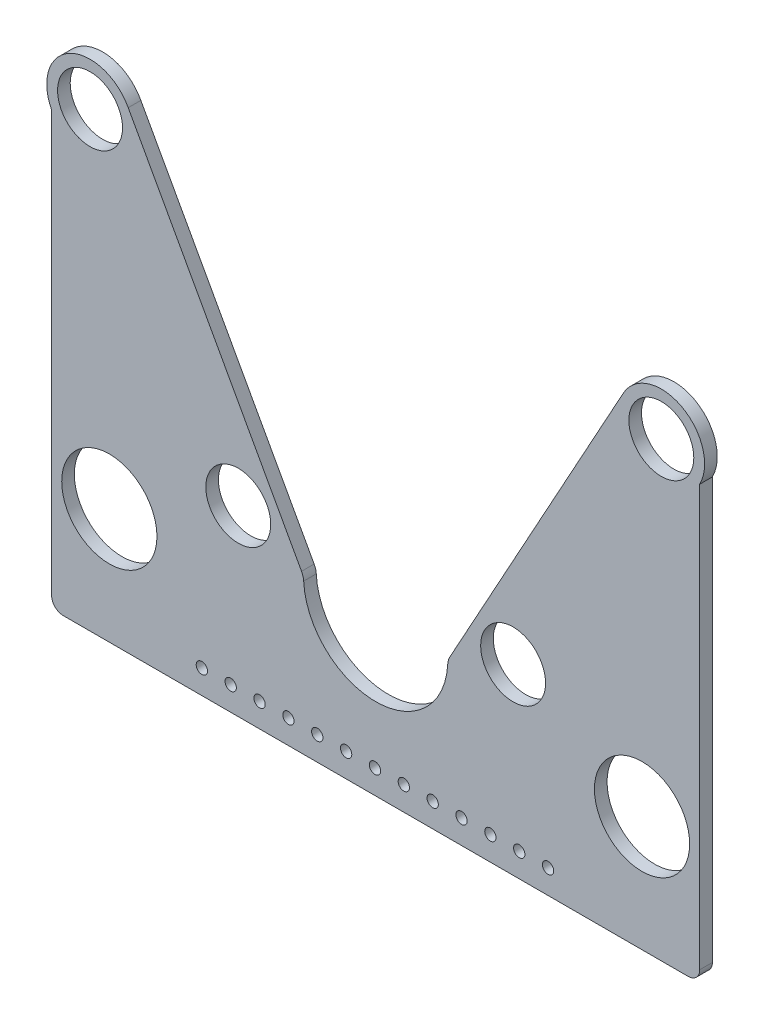
ISO-10303-21;
HEADER;
FILE_DESCRIPTION(('STEP AP214'),'2;1');
FILE_NAME('part.step','',(''),(''),'','','');
FILE_SCHEMA(('AUTOMOTIVE_DESIGN { 1 0 10303 214 1 1 1 1 }'));
ENDSEC;
DATA;
#1=APPLICATION_CONTEXT('core data for automotive mechanical design processes');
#2=APPLICATION_PROTOCOL_DEFINITION('international standard','automotive_design',2000,#1);
#3=PRODUCT_CONTEXT('',#1,'mechanical');
#4=PRODUCT('Part','Part','',(#3));
#5=PRODUCT_RELATED_PRODUCT_CATEGORY('part','',(#4));
#6=PRODUCT_DEFINITION_FORMATION('','',#4);
#7=PRODUCT_DEFINITION_CONTEXT('part definition',#1,'design');
#8=PRODUCT_DEFINITION('design','',#6,#7);
#9=PRODUCT_DEFINITION_SHAPE('','',#8);
#10=(LENGTH_UNIT() NAMED_UNIT(*) SI_UNIT(.MILLI.,.METRE.));
#11=(NAMED_UNIT(*) PLANE_ANGLE_UNIT() SI_UNIT($,.RADIAN.));
#12=(NAMED_UNIT(*) SI_UNIT($,.STERADIAN.) SOLID_ANGLE_UNIT());
#13=UNCERTAINTY_MEASURE_WITH_UNIT(LENGTH_MEASURE(1.E-05),#10,'distance_accuracy_value','');
#14=(GEOMETRIC_REPRESENTATION_CONTEXT(3) GLOBAL_UNCERTAINTY_ASSIGNED_CONTEXT((#13)) GLOBAL_UNIT_ASSIGNED_CONTEXT((#10,
#11,#12)) REPRESENTATION_CONTEXT('',''));
#15=CARTESIAN_POINT('',(0.,0.,0.));
#16=DIRECTION('',(0.,0.,1.));
#17=DIRECTION('',(1.,0.,0.));
#18=AXIS2_PLACEMENT_3D('',#15,#16,#17);
#19=CARTESIAN_POINT('',(125.726814921125,131.243846083959,3.175));
#20=DIRECTION('',(0.,0.,-1.));
#21=DIRECTION('',(-1.,0.,0.));
#22=AXIS2_PLACEMENT_3D('',#19,#20,#21);
#23=CYLINDRICAL_SURFACE('',#22,19.0499999999958);
#24=DIRECTION('',(0.,0.,-1.));
#25=VECTOR('',#24,1.);
#26=CARTESIAN_POINT('',(142.632381684572,122.462939957225,3.175));
#27=LINE('',#26,#25);
#28=CARTESIAN_POINT('',(142.632381684572,122.462939957225,3.175));
#29=VERTEX_POINT('',#28);
#30=CARTESIAN_POINT('',(142.632381684572,122.462939957225,-2.38125));
#31=VERTEX_POINT('',#30);
#32=EDGE_CURVE('E251',#29,#31,#27,.T.);
#33=ORIENTED_EDGE('',*,*,#32,.T.);
#34=CARTESIAN_POINT('',(125.726814921125,131.243846083959,-2.38125));
#35=DIRECTION('',(0.,0.,-1.));
#36=DIRECTION('',(-1.,0.,0.));
#37=AXIS2_PLACEMENT_3D('',#34,#35,#36);
#38=CIRCLE('',#37,19.0499999999964);
#39=CARTESIAN_POINT('',(108.918256202358,140.209048468604,-2.38125));
#40=VERTEX_POINT('',#39);
#41=EDGE_CURVE('E156',#40,#31,#38,.T.);
#42=ORIENTED_EDGE('',*,*,#41,.F.);
#43=DIRECTION('',(0.,0.,-1.));
#44=VECTOR('',#43,1.);
#45=CARTESIAN_POINT('',(108.91825620236,140.209048468603,3.175));
#46=LINE('',#45,#44);
#47=CARTESIAN_POINT('',(108.91825620236,140.209048468603,3.175));
#48=VERTEX_POINT('',#47);
#49=EDGE_CURVE('E151',#48,#40,#46,.T.);
#50=ORIENTED_EDGE('',*,*,#49,.F.);
#51=CARTESIAN_POINT('',(125.726814921125,131.243846083959,3.175));
#52=DIRECTION('',(0.,0.,1.));
#53=DIRECTION('',(1.,0.,0.));
#54=AXIS2_PLACEMENT_3D('',#51,#52,#53);
#55=CIRCLE('',#54,19.0499999999958);
#56=EDGE_CURVE('E843',#48,#29,#55,.F.);
#57=ORIENTED_EDGE('',*,*,#56,.T.);
#58=EDGE_LOOP('',(#33,#42,#50,#57));
#59=FACE_BOUND('',#58,.T.);
#60=ADVANCED_FACE('F50',(#59),#23,.T.);
#61=CARTESIAN_POINT('',(24.3683765677404,-13.4118671138123,3.175));
#62=DIRECTION('',(-0.876075295504557,0.482174321803435,0.));
#63=DIRECTION('',(-0.482174321803435,-0.876075295504557,0.));
#64=AXIS2_PLACEMENT_3D('',#61,#62,#63);
#65=PLANE('',#64);
#66=ORIENTED_EDGE('',*,*,#49,.T.);
#67=DIRECTION('',(0.482174321803429,0.876075295504561,0.));
#68=VECTOR('',#67,1.);
#69=CARTESIAN_POINT('',(32.6405824860178,1.61812290561451,-2.38125));
#70=LINE('',#69,#68);
#71=CARTESIAN_POINT('',(32.6405824860178,1.61812290561451,-2.38125));
#72=VERTEX_POINT('',#71);
#73=EDGE_CURVE('E148',#72,#40,#70,.T.);
#74=ORIENTED_EDGE('',*,*,#73,.F.);
#75=DIRECTION('',(0.,0.,-1.));
#76=VECTOR('',#75,1.);
#77=CARTESIAN_POINT('',(32.6405824860178,1.61812290561451,3.175));
#78=LINE('',#77,#76);
#79=CARTESIAN_POINT('',(32.6405824860178,1.61812290561451,3.175));
#80=VERTEX_POINT('',#79);
#81=EDGE_CURVE('E74',#72,#80,#78,.F.);
#82=ORIENTED_EDGE('',*,*,#81,.T.);
#83=DIRECTION('',(0.482174321803435,0.876075295504557,0.));
#84=VECTOR('',#83,1.);
#85=CARTESIAN_POINT('',(24.3683765677404,-13.4118671138123,3.175));
#86=LINE('',#85,#84);
#87=EDGE_CURVE('E837',#80,#48,#86,.T.);
#88=ORIENTED_EDGE('',*,*,#87,.T.);
#89=EDGE_LOOP('',(#66,#74,#82,#88));
#90=FACE_BOUND('',#89,.T.);
#91=ADVANCED_FACE('F149',(#90),#65,.T.);
#92=CARTESIAN_POINT('',(0.,0.,3.175));
#93=DIRECTION('',(0.,0.,-1.));
#94=DIRECTION('',(-1.,0.,0.));
#95=AXIS2_PLACEMENT_3D('',#92,#93,#94);
#96=CYLINDRICAL_SURFACE('',#95,31.75);
#97=CARTESIAN_POINT('',(0.,0.,3.175));
#98=DIRECTION('',(0.,0.,1.));
#99=DIRECTION('',(1.,0.,0.));
#100=AXIS2_PLACEMENT_3D('',#97,#98,#99);
#101=CIRCLE('',#100,31.75);
#102=CARTESIAN_POINT('',(-31.7066743852924,-1.65810115042554,3.175));
#103=VERTEX_POINT('',#102);
#104=CARTESIAN_POINT('',(31.7066743852924,-1.65810115042554,3.175));
#105=VERTEX_POINT('',#104);
#106=EDGE_CURVE('E834',#103,#105,#101,.T.);
#107=ORIENTED_EDGE('',*,*,#106,.T.);
#108=DIRECTION('',(0.,0.,-1.));
#109=VECTOR('',#108,1.);
#110=CARTESIAN_POINT('',(31.7066743852924,-1.65810115042554,3.175));
#111=LINE('',#110,#109);
#112=CARTESIAN_POINT('',(31.7066743852924,-1.65810115042552,-2.38125));
#113=VERTEX_POINT('',#112);
#114=EDGE_CURVE('E145',#105,#113,#111,.T.);
#115=ORIENTED_EDGE('',*,*,#114,.T.);
#116=CARTESIAN_POINT('',(0.,0.,-2.38125));
#117=DIRECTION('',(0.,0.,1.));
#118=DIRECTION('',(-1.,0.,0.));
#119=AXIS2_PLACEMENT_3D('',#116,#117,#118);
#120=CIRCLE('',#119,31.75);
#121=CARTESIAN_POINT('',(-31.7066743852924,-1.65810115042556,-2.38125));
#122=VERTEX_POINT('',#121);
#123=EDGE_CURVE('E163',#122,#113,#120,.T.);
#124=ORIENTED_EDGE('',*,*,#123,.F.);
#125=DIRECTION('',(0.,0.,-1.));
#126=VECTOR('',#125,1.);
#127=CARTESIAN_POINT('',(-31.7066743852924,-1.65810115042554,3.175));
#128=LINE('',#127,#126);
#129=EDGE_CURVE('E269',#122,#103,#128,.F.);
#130=ORIENTED_EDGE('',*,*,#129,.T.);
#131=EDGE_LOOP('',(#107,#115,#124,#130));
#132=FACE_BOUND('',#131,.T.);
#133=ADVANCED_FACE('F349',(#132),#96,.F.);
#134=CARTESIAN_POINT('',(-24.3683765677404,-13.4118671138123,3.175));
#135=DIRECTION('',(-0.876075295504557,-0.482174321803435,0.));
#136=DIRECTION('',(0.482174321803435,-0.876075295504557,0.));
#137=AXIS2_PLACEMENT_3D('',#134,#135,#136);
#138=PLANE('',#137);
#139=DIRECTION('',(-0.482174321803435,0.876075295504557,0.));
#140=VECTOR('',#139,1.);
#141=CARTESIAN_POINT('',(-24.3683765677404,-13.4118671138123,3.175));
#142=LINE('',#141,#140);
#143=CARTESIAN_POINT('',(-32.6405824860178,1.61812290561451,3.175));
#144=VERTEX_POINT('',#143);
#145=CARTESIAN_POINT('',(-108.91825620236,140.209048468603,3.175));
#146=VERTEX_POINT('',#145);
#147=EDGE_CURVE('E836',#144,#146,#142,.T.);
#148=ORIENTED_EDGE('',*,*,#147,.F.);
#149=DIRECTION('',(0.,0.,1.));
#150=VECTOR('',#149,1.);
#151=CARTESIAN_POINT('',(-32.6405824860178,1.61812290561451,0.));
#152=LINE('',#151,#150);
#153=CARTESIAN_POINT('',(-32.6405824860178,1.61812290561451,-2.38125));
#154=VERTEX_POINT('',#153);
#155=EDGE_CURVE('E12',#144,#154,#152,.F.);
#156=ORIENTED_EDGE('',*,*,#155,.T.);
#157=DIRECTION('',(0.482174321803435,-0.876075295504557,0.));
#158=VECTOR('',#157,1.);
#159=CARTESIAN_POINT('',(-108.91825620236,140.209048468603,-2.38125));
#160=LINE('',#159,#158);
#161=CARTESIAN_POINT('',(-108.91825620236,140.209048468603,-2.38125));
#162=VERTEX_POINT('',#161);
#163=EDGE_CURVE('E199',#162,#154,#160,.T.);
#164=ORIENTED_EDGE('',*,*,#163,.F.);
#165=DIRECTION('',(0.,0.,-1.));
#166=VECTOR('',#165,1.);
#167=CARTESIAN_POINT('',(-108.91825620236,140.209048468603,3.175));
#168=LINE('',#167,#166);
#169=EDGE_CURVE('E270',#146,#162,#168,.T.);
#170=ORIENTED_EDGE('',*,*,#169,.F.);
#171=EDGE_LOOP('',(#148,#156,#164,#170));
#172=FACE_BOUND('',#171,.T.);
#173=ADVANCED_FACE('F691',(#172),#138,.F.);
#174=CARTESIAN_POINT('',(-125.726814921127,131.243846083957,3.175));
#175=DIRECTION('',(0.,0.,-1.));
#176=DIRECTION('',(-1.,0.,0.));
#177=AXIS2_PLACEMENT_3D('',#174,#175,#176);
#178=CYLINDRICAL_SURFACE('',#177,19.0499999999976);
#179=ORIENTED_EDGE('',*,*,#169,.T.);
#180=CARTESIAN_POINT('',(-125.726814921127,131.243846083957,-2.38125));
#181=DIRECTION('',(0.,0.,-1.));
#182=DIRECTION('',(-1.,0.,0.));
#183=AXIS2_PLACEMENT_3D('',#180,#181,#182);
#184=CIRCLE('',#183,19.0499999999979);
#185=CARTESIAN_POINT('',(-142.632381684575,122.462939957221,-2.38125));
#186=VERTEX_POINT('',#185);
#187=EDGE_CURVE('E195',#186,#162,#184,.T.);
#188=ORIENTED_EDGE('',*,*,#187,.F.);
#189=DIRECTION('',(0.,0.,-1.));
#190=VECTOR('',#189,1.);
#191=CARTESIAN_POINT('',(-142.632381684574,122.462939957222,3.175));
#192=LINE('',#191,#190);
#193=CARTESIAN_POINT('',(-142.632381684574,122.462939957222,3.175));
#194=VERTEX_POINT('',#193);
#195=EDGE_CURVE('E295',#194,#186,#192,.T.);
#196=ORIENTED_EDGE('',*,*,#195,.F.);
#197=CARTESIAN_POINT('',(-125.726814921127,131.243846083957,3.175));
#198=DIRECTION('',(0.,0.,1.));
#199=DIRECTION('',(1.,0.,0.));
#200=AXIS2_PLACEMENT_3D('',#197,#198,#199);
#201=CIRCLE('',#200,19.0499999999976);
#202=EDGE_CURVE('E841',#146,#194,#201,.T.);
#203=ORIENTED_EDGE('',*,*,#202,.F.);
#204=EDGE_LOOP('',(#179,#188,#196,#203));
#205=FACE_BOUND('',#204,.T.);
#206=ADVANCED_FACE('F681',(#205),#178,.T.);
#207=CARTESIAN_POINT('',(-142.632381684574,0.,3.175));
#208=DIRECTION('',(1.,0.,0.));
#209=DIRECTION('',(0.,0.,-1.));
#210=AXIS2_PLACEMENT_3D('',#207,#208,#209);
#211=PLANE('',#210);
#212=ORIENTED_EDGE('',*,*,#195,.T.);
#213=DIRECTION('',(0.,1.,0.));
#214=VECTOR('',#213,1.);
#215=CARTESIAN_POINT('',(-142.632381684574,-62.6205007711604,-2.38125));
#216=LINE('',#215,#214);
#217=CARTESIAN_POINT('',(-142.632381684574,-62.6205007711604,-2.38125));
#218=VERTEX_POINT('',#217);
#219=EDGE_CURVE('E191',#218,#186,#216,.T.);
#220=ORIENTED_EDGE('',*,*,#219,.F.);
#221=DIRECTION('',(0.,0.,-1.));
#222=VECTOR('',#221,1.);
#223=CARTESIAN_POINT('',(-142.632381684574,-62.6205007711604,3.175));
#224=LINE('',#223,#222);
#225=CARTESIAN_POINT('',(-142.632381684574,-62.6205007711604,3.175));
#226=VERTEX_POINT('',#225);
#227=EDGE_CURVE('E299',#226,#218,#224,.T.);
#228=ORIENTED_EDGE('',*,*,#227,.F.);
#229=DIRECTION('',(0.,-1.,0.));
#230=VECTOR('',#229,1.);
#231=CARTESIAN_POINT('',(-142.632381684574,0.,3.175));
#232=LINE('',#231,#230);
#233=EDGE_CURVE('E850',#194,#226,#232,.T.);
#234=ORIENTED_EDGE('',*,*,#233,.F.);
#235=EDGE_LOOP('',(#212,#220,#228,#234));
#236=FACE_BOUND('',#235,.T.);
#237=ADVANCED_FACE('F670',(#236),#211,.F.);
#238=CARTESIAN_POINT('',(-137.552381684574,-62.6205007711604,3.175));
#239=DIRECTION('',(0.,0.,-1.));
#240=DIRECTION('',(-1.,0.,0.));
#241=AXIS2_PLACEMENT_3D('',#238,#239,#240);
#242=CYLINDRICAL_SURFACE('',#241,5.08);
#243=ORIENTED_EDGE('',*,*,#227,.T.);
#244=CARTESIAN_POINT('',(-137.552381684574,-62.6205007711604,-2.38125));
#245=DIRECTION('',(0.,0.,-1.));
#246=DIRECTION('',(-1.,0.,0.));
#247=AXIS2_PLACEMENT_3D('',#244,#245,#246);
#248=CIRCLE('',#247,5.08);
#249=CARTESIAN_POINT('',(-137.552381684574,-67.7005007711604,-2.38125));
#250=VERTEX_POINT('',#249);
#251=EDGE_CURVE('E187',#250,#218,#248,.T.);
#252=ORIENTED_EDGE('',*,*,#251,.F.);
#253=DIRECTION('',(0.,0.,-1.));
#254=VECTOR('',#253,1.);
#255=CARTESIAN_POINT('',(-137.552381684574,-67.7005007711604,3.175));
#256=LINE('',#255,#254);
#257=CARTESIAN_POINT('',(-137.552381684574,-67.7005007711604,3.175));
#258=VERTEX_POINT('',#257);
#259=EDGE_CURVE('E302',#258,#250,#256,.T.);
#260=ORIENTED_EDGE('',*,*,#259,.F.);
#261=CARTESIAN_POINT('',(-137.552381684574,-62.6205007711604,3.175));
#262=DIRECTION('',(0.,0.,1.));
#263=DIRECTION('',(1.,0.,0.));
#264=AXIS2_PLACEMENT_3D('',#261,#262,#263);
#265=CIRCLE('',#264,5.08);
#266=EDGE_CURVE('E854',#226,#258,#265,.T.);
#267=ORIENTED_EDGE('',*,*,#266,.F.);
#268=EDGE_LOOP('',(#243,#252,#260,#267));
#269=FACE_BOUND('',#268,.T.);
#270=ADVANCED_FACE('F338',(#269),#242,.T.);
#271=CARTESIAN_POINT('',(0.,-67.7005007711604,3.175));
#272=DIRECTION('',(0.,1.,0.));
#273=DIRECTION('',(0.,0.,1.));
#274=AXIS2_PLACEMENT_3D('',#271,#272,#273);
#275=PLANE('',#274);
#276=ORIENTED_EDGE('',*,*,#259,.T.);
#277=DIRECTION('',(-1.,0.,0.));
#278=VECTOR('',#277,1.);
#279=CARTESIAN_POINT('',(137.552381684574,-67.7005007711604,-2.38125));
#280=LINE('',#279,#278);
#281=CARTESIAN_POINT('',(137.552381684574,-67.7005007711604,-2.38125));
#282=VERTEX_POINT('',#281);
#283=EDGE_CURVE('E183',#282,#250,#280,.T.);
#284=ORIENTED_EDGE('',*,*,#283,.F.);
#285=DIRECTION('',(0.,0.,-1.));
#286=VECTOR('',#285,1.);
#287=CARTESIAN_POINT('',(137.552381684574,-67.7005007711604,3.175));
#288=LINE('',#287,#286);
#289=CARTESIAN_POINT('',(137.552381684574,-67.7005007711604,3.175));
#290=VERTEX_POINT('',#289);
#291=EDGE_CURVE('E310',#290,#282,#288,.T.);
#292=ORIENTED_EDGE('',*,*,#291,.F.);
#293=DIRECTION('',(1.,0.,0.));
#294=VECTOR('',#293,1.);
#295=CARTESIAN_POINT('',(0.,-67.7005007711604,3.175));
#296=LINE('',#295,#294);
#297=EDGE_CURVE('E858',#258,#290,#296,.T.);
#298=ORIENTED_EDGE('',*,*,#297,.F.);
#299=EDGE_LOOP('',(#276,#284,#292,#298));
#300=FACE_BOUND('',#299,.T.);
#301=ADVANCED_FACE('F329',(#300),#275,.F.);
#302=CARTESIAN_POINT('',(137.552381684574,-62.6205007711604,3.175));
#303=DIRECTION('',(0.,0.,-1.));
#304=DIRECTION('',(-1.,0.,0.));
#305=AXIS2_PLACEMENT_3D('',#302,#303,#304);
#306=CYLINDRICAL_SURFACE('',#305,5.08);
#307=ORIENTED_EDGE('',*,*,#291,.T.);
#308=CARTESIAN_POINT('',(137.552381684574,-62.6205007711604,-2.38125));
#309=DIRECTION('',(0.,0.,-1.));
#310=DIRECTION('',(-1.,0.,0.));
#311=AXIS2_PLACEMENT_3D('',#308,#309,#310);
#312=CIRCLE('',#311,5.08);
#313=CARTESIAN_POINT('',(142.632381684574,-62.6205007711604,-2.38125));
#314=VERTEX_POINT('',#313);
#315=EDGE_CURVE('E179',#314,#282,#312,.T.);
#316=ORIENTED_EDGE('',*,*,#315,.F.);
#317=DIRECTION('',(0.,0.,-1.));
#318=VECTOR('',#317,1.);
#319=CARTESIAN_POINT('',(142.632381684574,-62.6205007711604,3.175));
#320=LINE('',#319,#318);
#321=CARTESIAN_POINT('',(142.632381684574,-62.6205007711604,3.175));
#322=VERTEX_POINT('',#321);
#323=EDGE_CURVE('E255',#322,#314,#320,.T.);
#324=ORIENTED_EDGE('',*,*,#323,.F.);
#325=CARTESIAN_POINT('',(137.552381684574,-62.6205007711604,3.175));
#326=DIRECTION('',(0.,0.,1.));
#327=DIRECTION('',(1.,0.,0.));
#328=AXIS2_PLACEMENT_3D('',#325,#326,#327);
#329=CIRCLE('',#328,5.08);
#330=EDGE_CURVE('E862',#290,#322,#329,.T.);
#331=ORIENTED_EDGE('',*,*,#330,.F.);
#332=EDGE_LOOP('',(#307,#316,#324,#331));
#333=FACE_BOUND('',#332,.T.);
#334=ADVANCED_FACE('F326',(#333),#306,.T.);
#335=CARTESIAN_POINT('',(-60.4845323125525,12.7000000000026,3.175));
#336=DIRECTION('',(0.,0.,-1.));
#337=DIRECTION('',(-1.,0.,0.));
#338=AXIS2_PLACEMENT_3D('',#335,#336,#337);
#339=CYLINDRICAL_SURFACE('',#338,14.2874999999995);
#340=CARTESIAN_POINT('',(-60.4845323125525,12.7000000000026,3.175));
#341=DIRECTION('',(0.,0.,1.));
#342=DIRECTION('',(1.,0.,0.));
#343=AXIS2_PLACEMENT_3D('',#340,#341,#342);
#344=CIRCLE('',#343,14.2874999999995);
#345=CARTESIAN_POINT('',(-46.197032312553,12.7000000000026,3.175));
#346=VERTEX_POINT('',#345);
#347=EDGE_CURVE('E238',#346,#346,#344,.T.);
#348=ORIENTED_EDGE('',*,*,#347,.T.);
#349=EDGE_LOOP('',(#348));
#350=FACE_BOUND('',#349,.T.);
#351=CARTESIAN_POINT('',(-60.4845323125525,12.7000000000026,-2.38125));
#352=DIRECTION('',(0.,0.,-1.));
#353=DIRECTION('',(-1.,0.,0.));
#354=AXIS2_PLACEMENT_3D('',#351,#352,#353);
#355=CIRCLE('',#354,14.2874999999995);
#356=CARTESIAN_POINT('',(-74.772032312552,12.7000000000026,-2.38125));
#357=VERTEX_POINT('',#356);
#358=EDGE_CURVE('E881',#357,#357,#355,.T.);
#359=ORIENTED_EDGE('',*,*,#358,.T.);
#360=EDGE_LOOP('',(#359));
#361=FACE_BOUND('',#360,.T.);
#362=ADVANCED_FACE('F328',(#350,#361),#339,.F.);
#363=CARTESIAN_POINT('',(-125.726814921127,131.243846083957,3.175));
#364=DIRECTION('',(0.,0.,-1.));
#365=DIRECTION('',(-1.,0.,0.));
#366=AXIS2_PLACEMENT_3D('',#363,#364,#365);
#367=CYLINDRICAL_SURFACE('',#366,14.2875);
#368=CARTESIAN_POINT('',(-125.726814921127,131.243846083957,3.175));
#369=DIRECTION('',(0.,0.,1.));
#370=DIRECTION('',(1.,0.,0.));
#371=AXIS2_PLACEMENT_3D('',#368,#369,#370);
#372=CIRCLE('',#371,14.2875);
#373=CARTESIAN_POINT('',(-111.439314921128,131.243846083957,3.175));
#374=VERTEX_POINT('',#373);
#375=EDGE_CURVE('E245',#374,#374,#372,.T.);
#376=ORIENTED_EDGE('',*,*,#375,.T.);
#377=EDGE_LOOP('',(#376));
#378=FACE_BOUND('',#377,.T.);
#379=CARTESIAN_POINT('',(-125.726814921127,131.243846083957,-2.38125));
#380=DIRECTION('',(0.,0.,-1.));
#381=DIRECTION('',(-1.,0.,0.));
#382=AXIS2_PLACEMENT_3D('',#379,#380,#381);
#383=CIRCLE('',#382,14.2875);
#384=CARTESIAN_POINT('',(-140.014314921127,131.243846083957,-2.38125));
#385=VERTEX_POINT('',#384);
#386=EDGE_CURVE('E897',#385,#385,#383,.T.);
#387=ORIENTED_EDGE('',*,*,#386,.T.);
#388=EDGE_LOOP('',(#387));
#389=FACE_BOUND('',#388,.T.);
#390=ADVANCED_FACE('F335',(#378,#389),#367,.F.);
#391=CARTESIAN_POINT('',(142.632381684574,0.,3.175));
#392=DIRECTION('',(-1.,0.,0.));
#393=DIRECTION('',(0.,0.,1.));
#394=AXIS2_PLACEMENT_3D('',#391,#392,#393);
#395=PLANE('',#394);
#396=ORIENTED_EDGE('',*,*,#323,.T.);
#397=DIRECTION('',(0.,-1.,0.));
#398=VECTOR('',#397,1.);
#399=CARTESIAN_POINT('',(142.632381684572,122.462939957225,-2.38125));
#400=LINE('',#399,#398);
#401=EDGE_CURVE('E175',#31,#314,#400,.T.);
#402=ORIENTED_EDGE('',*,*,#401,.F.);
#403=ORIENTED_EDGE('',*,*,#32,.F.);
#404=DIRECTION('',(0.,1.,0.));
#405=VECTOR('',#404,1.);
#406=CARTESIAN_POINT('',(142.632381684574,0.,3.175));
#407=LINE('',#406,#405);
#408=EDGE_CURVE('E323',#322,#29,#407,.T.);
#409=ORIENTED_EDGE('',*,*,#408,.F.);
#410=EDGE_LOOP('',(#396,#402,#403,#409));
#411=FACE_BOUND('',#410,.T.);
#412=ADVANCED_FACE('F321',(#411),#395,.F.);
#413=CARTESIAN_POINT('',(125.726814921125,131.243846083959,3.175));
#414=DIRECTION('',(0.,0.,-1.));
#415=DIRECTION('',(-1.,0.,0.));
#416=AXIS2_PLACEMENT_3D('',#413,#414,#415);
#417=CYLINDRICAL_SURFACE('',#416,14.2875);
#418=CARTESIAN_POINT('',(125.726814921125,131.243846083959,3.175));
#419=DIRECTION('',(0.,0.,1.));
#420=DIRECTION('',(1.,0.,0.));
#421=AXIS2_PLACEMENT_3D('',#418,#419,#420);
#422=CIRCLE('',#421,14.2875);
#423=CARTESIAN_POINT('',(140.014314921125,131.243846083959,3.175));
#424=VERTEX_POINT('',#423);
#425=EDGE_CURVE('E999',#424,#424,#422,.F.);
#426=ORIENTED_EDGE('',*,*,#425,.F.);
#427=EDGE_LOOP('',(#426));
#428=FACE_BOUND('',#427,.T.);
#429=CARTESIAN_POINT('',(125.726814921125,131.243846083959,-2.38125));
#430=DIRECTION('',(0.,0.,-1.));
#431=DIRECTION('',(-1.,0.,0.));
#432=AXIS2_PLACEMENT_3D('',#429,#430,#431);
#433=CIRCLE('',#432,14.2875);
#434=CARTESIAN_POINT('',(111.439314921125,131.243846083959,-2.38125));
#435=VERTEX_POINT('',#434);
#436=EDGE_CURVE('E890',#435,#435,#433,.T.);
#437=ORIENTED_EDGE('',*,*,#436,.T.);
#438=EDGE_LOOP('',(#437));
#439=FACE_BOUND('',#438,.T.);
#440=ADVANCED_FACE('F353',(#428,#439),#417,.F.);
#441=CARTESIAN_POINT('',(-76.5175000000006,-57.1499999999989,3.175));
#442=DIRECTION('',(0.,0.,-1.));
#443=DIRECTION('',(-1.,0.,0.));
#444=AXIS2_PLACEMENT_3D('',#441,#442,#443);
#445=CYLINDRICAL_SURFACE('',#444,2.4891999999998);
#446=CARTESIAN_POINT('',(-76.5175000000006,-57.1499999999989,3.175));
#447=DIRECTION('',(0.,0.,1.));
#448=DIRECTION('',(1.,0.,0.));
#449=AXIS2_PLACEMENT_3D('',#446,#447,#448);
#450=CIRCLE('',#449,2.4891999999998);
#451=CARTESIAN_POINT('',(-74.0283000000008,-57.1499999999989,3.175));
#452=VERTEX_POINT('',#451);
#453=EDGE_CURVE('E1002',#452,#452,#450,.T.);
#454=ORIENTED_EDGE('',*,*,#453,.T.);
#455=EDGE_LOOP('',(#454));
#456=FACE_BOUND('',#455,.T.);
#457=CARTESIAN_POINT('',(-76.5175000000006,-57.1499999999989,-2.38125));
#458=DIRECTION('',(0.,0.,-1.));
#459=DIRECTION('',(-1.,0.,0.));
#460=AXIS2_PLACEMENT_3D('',#457,#458,#459);
#461=CIRCLE('',#460,2.4891999999998);
#462=CARTESIAN_POINT('',(-79.0067000000004,-57.1499999999989,-2.38125));
#463=VERTEX_POINT('',#462);
#464=EDGE_CURVE('E901',#463,#463,#461,.T.);
#465=ORIENTED_EDGE('',*,*,#464,.T.);
#466=EDGE_LOOP('',(#465));
#467=FACE_BOUND('',#466,.T.);
#468=ADVANCED_FACE('F356',(#456,#467),#445,.F.);
#469=CARTESIAN_POINT('',(-63.8175000000006,-57.1499999999989,3.175));
#470=DIRECTION('',(0.,0.,-1.));
#471=DIRECTION('',(-1.,0.,0.));
#472=AXIS2_PLACEMENT_3D('',#469,#470,#471);
#473=CYLINDRICAL_SURFACE('',#472,2.4891999999998);
#474=CARTESIAN_POINT('',(-63.8175000000006,-57.1499999999989,3.175));
#475=DIRECTION('',(0.,0.,1.));
#476=DIRECTION('',(1.,0.,0.));
#477=AXIS2_PLACEMENT_3D('',#474,#475,#476);
#478=CIRCLE('',#477,2.4891999999998);
#479=CARTESIAN_POINT('',(-61.3283000000008,-57.1499999999989,3.175));
#480=VERTEX_POINT('',#479);
#481=EDGE_CURVE('E1008',#480,#480,#478,.T.);
#482=ORIENTED_EDGE('',*,*,#481,.T.);
#483=EDGE_LOOP('',(#482));
#484=FACE_BOUND('',#483,.T.);
#485=CARTESIAN_POINT('',(-63.8175000000006,-57.1499999999989,-2.38125));
#486=DIRECTION('',(0.,0.,-1.));
#487=DIRECTION('',(-1.,0.,0.));
#488=AXIS2_PLACEMENT_3D('',#485,#486,#487);
#489=CIRCLE('',#488,2.4891999999998);
#490=CARTESIAN_POINT('',(-66.3067000000004,-57.1499999999989,-2.38125));
#491=VERTEX_POINT('',#490);
#492=EDGE_CURVE('E905',#491,#491,#489,.T.);
#493=ORIENTED_EDGE('',*,*,#492,.T.);
#494=EDGE_LOOP('',(#493));
#495=FACE_BOUND('',#494,.T.);
#496=ADVANCED_FACE('F360',(#484,#495),#473,.F.);
#497=CARTESIAN_POINT('',(-51.1175000000006,-57.1499999999989,3.175));
#498=DIRECTION('',(0.,0.,-1.));
#499=DIRECTION('',(-1.,0.,0.));
#500=AXIS2_PLACEMENT_3D('',#497,#498,#499);
#501=CYLINDRICAL_SURFACE('',#500,2.4891999999998);
#502=CARTESIAN_POINT('',(-51.1175000000006,-57.1499999999989,3.175));
#503=DIRECTION('',(0.,0.,1.));
#504=DIRECTION('',(1.,0.,0.));
#505=AXIS2_PLACEMENT_3D('',#502,#503,#504);
#506=CIRCLE('',#505,2.4891999999998);
#507=CARTESIAN_POINT('',(-48.6283000000008,-57.1499999999989,3.175));
#508=VERTEX_POINT('',#507);
#509=EDGE_CURVE('E1012',#508,#508,#506,.T.);
#510=ORIENTED_EDGE('',*,*,#509,.T.);
#511=EDGE_LOOP('',(#510));
#512=FACE_BOUND('',#511,.T.);
#513=CARTESIAN_POINT('',(-51.1175000000006,-57.1499999999989,-2.38125));
#514=DIRECTION('',(0.,0.,-1.));
#515=DIRECTION('',(-1.,0.,0.));
#516=AXIS2_PLACEMENT_3D('',#513,#514,#515);
#517=CIRCLE('',#516,2.4891999999998);
#518=CARTESIAN_POINT('',(-53.6067000000004,-57.1499999999989,-2.38125));
#519=VERTEX_POINT('',#518);
#520=EDGE_CURVE('E909',#519,#519,#517,.T.);
#521=ORIENTED_EDGE('',*,*,#520,.T.);
#522=EDGE_LOOP('',(#521));
#523=FACE_BOUND('',#522,.T.);
#524=ADVANCED_FACE('F364',(#512,#523),#501,.F.);
#525=CARTESIAN_POINT('',(-38.4175000000006,-57.1499999999989,3.175));
#526=DIRECTION('',(0.,0.,-1.));
#527=DIRECTION('',(-1.,0.,0.));
#528=AXIS2_PLACEMENT_3D('',#525,#526,#527);
#529=CYLINDRICAL_SURFACE('',#528,2.4891999999998);
#530=CARTESIAN_POINT('',(-38.4175000000006,-57.1499999999989,3.175));
#531=DIRECTION('',(0.,0.,1.));
#532=DIRECTION('',(1.,0.,0.));
#533=AXIS2_PLACEMENT_3D('',#530,#531,#532);
#534=CIRCLE('',#533,2.4891999999998);
#535=CARTESIAN_POINT('',(-35.9283000000008,-57.1499999999989,3.175));
#536=VERTEX_POINT('',#535);
#537=EDGE_CURVE('E1016',#536,#536,#534,.T.);
#538=ORIENTED_EDGE('',*,*,#537,.T.);
#539=EDGE_LOOP('',(#538));
#540=FACE_BOUND('',#539,.T.);
#541=CARTESIAN_POINT('',(-38.4175000000006,-57.1499999999989,-2.38125));
#542=DIRECTION('',(0.,0.,-1.));
#543=DIRECTION('',(-1.,0.,0.));
#544=AXIS2_PLACEMENT_3D('',#541,#542,#543);
#545=CIRCLE('',#544,2.4891999999998);
#546=CARTESIAN_POINT('',(-40.9067000000004,-57.1499999999989,-2.38125));
#547=VERTEX_POINT('',#546);
#548=EDGE_CURVE('E913',#547,#547,#545,.T.);
#549=ORIENTED_EDGE('',*,*,#548,.T.);
#550=EDGE_LOOP('',(#549));
#551=FACE_BOUND('',#550,.T.);
#552=ADVANCED_FACE('F368',(#540,#551),#529,.F.);
#553=CARTESIAN_POINT('',(-25.7175000000006,-57.1499999999989,3.175));
#554=DIRECTION('',(0.,0.,-1.));
#555=DIRECTION('',(-1.,0.,0.));
#556=AXIS2_PLACEMENT_3D('',#553,#554,#555);
#557=CYLINDRICAL_SURFACE('',#556,2.4891999999998);
#558=CARTESIAN_POINT('',(-25.7175000000006,-57.1499999999989,3.175));
#559=DIRECTION('',(0.,0.,1.));
#560=DIRECTION('',(1.,0.,0.));
#561=AXIS2_PLACEMENT_3D('',#558,#559,#560);
#562=CIRCLE('',#561,2.4891999999998);
#563=CARTESIAN_POINT('',(-23.2283000000008,-57.1499999999989,3.175));
#564=VERTEX_POINT('',#563);
#565=EDGE_CURVE('E1020',#564,#564,#562,.T.);
#566=ORIENTED_EDGE('',*,*,#565,.T.);
#567=EDGE_LOOP('',(#566));
#568=FACE_BOUND('',#567,.T.);
#569=CARTESIAN_POINT('',(-25.7175000000006,-57.1499999999989,-2.38125));
#570=DIRECTION('',(0.,0.,-1.));
#571=DIRECTION('',(-1.,0.,0.));
#572=AXIS2_PLACEMENT_3D('',#569,#570,#571);
#573=CIRCLE('',#572,2.4891999999998);
#574=CARTESIAN_POINT('',(-28.2067000000004,-57.1499999999989,-2.38125));
#575=VERTEX_POINT('',#574);
#576=EDGE_CURVE('E917',#575,#575,#573,.T.);
#577=ORIENTED_EDGE('',*,*,#576,.T.);
#578=EDGE_LOOP('',(#577));
#579=FACE_BOUND('',#578,.T.);
#580=ADVANCED_FACE('F372',(#568,#579),#557,.F.);
#581=CARTESIAN_POINT('',(-13.0175000000006,-57.1499999999989,3.175));
#582=DIRECTION('',(0.,0.,-1.));
#583=DIRECTION('',(-1.,0.,0.));
#584=AXIS2_PLACEMENT_3D('',#581,#582,#583);
#585=CYLINDRICAL_SURFACE('',#584,2.4891999999998);
#586=CARTESIAN_POINT('',(-13.0175000000006,-57.1499999999989,3.175));
#587=DIRECTION('',(0.,0.,1.));
#588=DIRECTION('',(1.,0.,0.));
#589=AXIS2_PLACEMENT_3D('',#586,#587,#588);
#590=CIRCLE('',#589,2.4891999999998);
#591=CARTESIAN_POINT('',(-10.5283000000008,-57.1499999999989,3.175));
#592=VERTEX_POINT('',#591);
#593=EDGE_CURVE('E1024',#592,#592,#590,.T.);
#594=ORIENTED_EDGE('',*,*,#593,.T.);
#595=EDGE_LOOP('',(#594));
#596=FACE_BOUND('',#595,.T.);
#597=CARTESIAN_POINT('',(-13.0175000000006,-57.1499999999989,-2.38125));
#598=DIRECTION('',(0.,0.,-1.));
#599=DIRECTION('',(-1.,0.,0.));
#600=AXIS2_PLACEMENT_3D('',#597,#598,#599);
#601=CIRCLE('',#600,2.4891999999998);
#602=CARTESIAN_POINT('',(-15.5067000000004,-57.1499999999989,-2.38125));
#603=VERTEX_POINT('',#602);
#604=EDGE_CURVE('E921',#603,#603,#601,.T.);
#605=ORIENTED_EDGE('',*,*,#604,.T.);
#606=EDGE_LOOP('',(#605));
#607=FACE_BOUND('',#606,.T.);
#608=ADVANCED_FACE('F376',(#596,#607),#585,.F.);
#609=CARTESIAN_POINT('',(-0.317500000000637,-57.1499999999989,3.175));
#610=DIRECTION('',(0.,0.,-1.));
#611=DIRECTION('',(-1.,0.,0.));
#612=AXIS2_PLACEMENT_3D('',#609,#610,#611);
#613=CYLINDRICAL_SURFACE('',#612,2.4891999999998);
#614=CARTESIAN_POINT('',(-0.317500000000637,-57.1499999999989,3.175));
#615=DIRECTION('',(0.,0.,1.));
#616=DIRECTION('',(1.,0.,0.));
#617=AXIS2_PLACEMENT_3D('',#614,#615,#616);
#618=CIRCLE('',#617,2.4891999999998);
#619=CARTESIAN_POINT('',(2.17169999999916,-57.1499999999989,3.175));
#620=VERTEX_POINT('',#619);
#621=EDGE_CURVE('E1028',#620,#620,#618,.T.);
#622=ORIENTED_EDGE('',*,*,#621,.T.);
#623=EDGE_LOOP('',(#622));
#624=FACE_BOUND('',#623,.T.);
#625=CARTESIAN_POINT('',(-0.317500000000637,-57.1499999999989,-2.38125));
#626=DIRECTION('',(0.,0.,-1.));
#627=DIRECTION('',(-1.,0.,0.));
#628=AXIS2_PLACEMENT_3D('',#625,#626,#627);
#629=CIRCLE('',#628,2.4891999999998);
#630=CARTESIAN_POINT('',(-2.80670000000044,-57.1499999999989,-2.38125));
#631=VERTEX_POINT('',#630);
#632=EDGE_CURVE('E925',#631,#631,#629,.T.);
#633=ORIENTED_EDGE('',*,*,#632,.T.);
#634=EDGE_LOOP('',(#633));
#635=FACE_BOUND('',#634,.T.);
#636=ADVANCED_FACE('F380',(#624,#635),#613,.F.);
#637=CARTESIAN_POINT('',(12.3824999999994,-57.1499999999989,3.175));
#638=DIRECTION('',(0.,0.,-1.));
#639=DIRECTION('',(-1.,0.,0.));
#640=AXIS2_PLACEMENT_3D('',#637,#638,#639);
#641=CYLINDRICAL_SURFACE('',#640,2.4891999999998);
#642=CARTESIAN_POINT('',(12.3824999999994,-57.1499999999989,3.175));
#643=DIRECTION('',(0.,0.,1.));
#644=DIRECTION('',(1.,0.,0.));
#645=AXIS2_PLACEMENT_3D('',#642,#643,#644);
#646=CIRCLE('',#645,2.4891999999998);
#647=CARTESIAN_POINT('',(14.8716999999992,-57.1499999999989,3.175));
#648=VERTEX_POINT('',#647);
#649=EDGE_CURVE('E1032',#648,#648,#646,.T.);
#650=ORIENTED_EDGE('',*,*,#649,.T.);
#651=EDGE_LOOP('',(#650));
#652=FACE_BOUND('',#651,.T.);
#653=CARTESIAN_POINT('',(12.3824999999994,-57.1499999999989,-2.38125));
#654=DIRECTION('',(0.,0.,-1.));
#655=DIRECTION('',(-1.,0.,0.));
#656=AXIS2_PLACEMENT_3D('',#653,#654,#655);
#657=CIRCLE('',#656,2.4891999999998);
#658=CARTESIAN_POINT('',(9.89329999999957,-57.1499999999989,-2.38125));
#659=VERTEX_POINT('',#658);
#660=EDGE_CURVE('E929',#659,#659,#657,.T.);
#661=ORIENTED_EDGE('',*,*,#660,.T.);
#662=EDGE_LOOP('',(#661));
#663=FACE_BOUND('',#662,.T.);
#664=ADVANCED_FACE('F384',(#652,#663),#641,.F.);
#665=CARTESIAN_POINT('',(25.0824999999994,-57.1499999999989,3.175));
#666=DIRECTION('',(0.,0.,-1.));
#667=DIRECTION('',(-1.,0.,0.));
#668=AXIS2_PLACEMENT_3D('',#665,#666,#667);
#669=CYLINDRICAL_SURFACE('',#668,2.4891999999998);
#670=CARTESIAN_POINT('',(25.0824999999994,-57.1499999999989,3.175));
#671=DIRECTION('',(0.,0.,1.));
#672=DIRECTION('',(1.,0.,0.));
#673=AXIS2_PLACEMENT_3D('',#670,#671,#672);
#674=CIRCLE('',#673,2.4891999999998);
#675=CARTESIAN_POINT('',(27.5716999999992,-57.1499999999989,3.175));
#676=VERTEX_POINT('',#675);
#677=EDGE_CURVE('E1036',#676,#676,#674,.T.);
#678=ORIENTED_EDGE('',*,*,#677,.T.);
#679=EDGE_LOOP('',(#678));
#680=FACE_BOUND('',#679,.T.);
#681=CARTESIAN_POINT('',(25.0824999999994,-57.1499999999989,-2.38125));
#682=DIRECTION('',(0.,0.,-1.));
#683=DIRECTION('',(-1.,0.,0.));
#684=AXIS2_PLACEMENT_3D('',#681,#682,#683);
#685=CIRCLE('',#684,2.4891999999998);
#686=CARTESIAN_POINT('',(22.5932999999996,-57.1499999999989,-2.38125));
#687=VERTEX_POINT('',#686);
#688=EDGE_CURVE('E933',#687,#687,#685,.T.);
#689=ORIENTED_EDGE('',*,*,#688,.T.);
#690=EDGE_LOOP('',(#689));
#691=FACE_BOUND('',#690,.T.);
#692=ADVANCED_FACE('F388',(#680,#691),#669,.F.);
#693=CARTESIAN_POINT('',(37.7824999999993,-57.1499999999989,3.175));
#694=DIRECTION('',(0.,0.,-1.));
#695=DIRECTION('',(-1.,0.,0.));
#696=AXIS2_PLACEMENT_3D('',#693,#694,#695);
#697=CYLINDRICAL_SURFACE('',#696,2.4891999999998);
#698=CARTESIAN_POINT('',(37.7824999999993,-57.1499999999989,3.175));
#699=DIRECTION('',(0.,0.,1.));
#700=DIRECTION('',(1.,0.,0.));
#701=AXIS2_PLACEMENT_3D('',#698,#699,#700);
#702=CIRCLE('',#701,2.4891999999998);
#703=CARTESIAN_POINT('',(40.2716999999992,-57.1499999999989,3.175));
#704=VERTEX_POINT('',#703);
#705=EDGE_CURVE('E1040',#704,#704,#702,.T.);
#706=ORIENTED_EDGE('',*,*,#705,.T.);
#707=EDGE_LOOP('',(#706));
#708=FACE_BOUND('',#707,.T.);
#709=CARTESIAN_POINT('',(37.7824999999993,-57.1499999999989,-2.38125));
#710=DIRECTION('',(0.,0.,-1.));
#711=DIRECTION('',(-1.,0.,0.));
#712=AXIS2_PLACEMENT_3D('',#709,#710,#711);
#713=CIRCLE('',#712,2.4891999999998);
#714=CARTESIAN_POINT('',(35.2932999999995,-57.1499999999989,-2.38125));
#715=VERTEX_POINT('',#714);
#716=EDGE_CURVE('E937',#715,#715,#713,.T.);
#717=ORIENTED_EDGE('',*,*,#716,.T.);
#718=EDGE_LOOP('',(#717));
#719=FACE_BOUND('',#718,.T.);
#720=ADVANCED_FACE('F392',(#708,#719),#697,.F.);
#721=CARTESIAN_POINT('',(50.4824999999994,-57.1499999999989,3.175));
#722=DIRECTION('',(0.,0.,-1.));
#723=DIRECTION('',(-1.,0.,0.));
#724=AXIS2_PLACEMENT_3D('',#721,#722,#723);
#725=CYLINDRICAL_SURFACE('',#724,2.4891999999998);
#726=CARTESIAN_POINT('',(50.4824999999994,-57.1499999999989,3.175));
#727=DIRECTION('',(0.,0.,1.));
#728=DIRECTION('',(1.,0.,0.));
#729=AXIS2_PLACEMENT_3D('',#726,#727,#728);
#730=CIRCLE('',#729,2.4891999999998);
#731=CARTESIAN_POINT('',(52.9716999999992,-57.1499999999989,3.175));
#732=VERTEX_POINT('',#731);
#733=EDGE_CURVE('E1044',#732,#732,#730,.T.);
#734=ORIENTED_EDGE('',*,*,#733,.T.);
#735=EDGE_LOOP('',(#734));
#736=FACE_BOUND('',#735,.T.);
#737=CARTESIAN_POINT('',(50.4824999999994,-57.1499999999989,-2.38125));
#738=DIRECTION('',(0.,0.,-1.));
#739=DIRECTION('',(-1.,0.,0.));
#740=AXIS2_PLACEMENT_3D('',#737,#738,#739);
#741=CIRCLE('',#740,2.4891999999998);
#742=CARTESIAN_POINT('',(47.9932999999996,-57.1499999999989,-2.38125));
#743=VERTEX_POINT('',#742);
#744=EDGE_CURVE('E941',#743,#743,#741,.T.);
#745=ORIENTED_EDGE('',*,*,#744,.T.);
#746=EDGE_LOOP('',(#745));
#747=FACE_BOUND('',#746,.T.);
#748=ADVANCED_FACE('F396',(#736,#747),#725,.F.);
#749=CARTESIAN_POINT('',(63.1824999999994,-57.1499999999989,3.175));
#750=DIRECTION('',(0.,0.,-1.));
#751=DIRECTION('',(-1.,0.,0.));
#752=AXIS2_PLACEMENT_3D('',#749,#750,#751);
#753=CYLINDRICAL_SURFACE('',#752,2.4891999999998);
#754=CARTESIAN_POINT('',(63.1824999999994,-57.1499999999989,3.175));
#755=DIRECTION('',(0.,0.,1.));
#756=DIRECTION('',(1.,0.,0.));
#757=AXIS2_PLACEMENT_3D('',#754,#755,#756);
#758=CIRCLE('',#757,2.4891999999998);
#759=CARTESIAN_POINT('',(65.6716999999991,-57.1499999999989,3.175));
#760=VERTEX_POINT('',#759);
#761=EDGE_CURVE('E1048',#760,#760,#758,.T.);
#762=ORIENTED_EDGE('',*,*,#761,.T.);
#763=EDGE_LOOP('',(#762));
#764=FACE_BOUND('',#763,.T.);
#765=CARTESIAN_POINT('',(63.1824999999994,-57.1499999999989,-2.38125));
#766=DIRECTION('',(0.,0.,-1.));
#767=DIRECTION('',(-1.,0.,0.));
#768=AXIS2_PLACEMENT_3D('',#765,#766,#767);
#769=CIRCLE('',#768,2.4891999999998);
#770=CARTESIAN_POINT('',(60.6932999999995,-57.1499999999989,-2.38125));
#771=VERTEX_POINT('',#770);
#772=EDGE_CURVE('E169',#771,#771,#769,.T.);
#773=ORIENTED_EDGE('',*,*,#772,.T.);
#774=EDGE_LOOP('',(#773));
#775=FACE_BOUND('',#774,.T.);
#776=ADVANCED_FACE('F400',(#764,#775),#753,.F.);
#777=CARTESIAN_POINT('',(75.8824999999993,-57.1499999999989,3.175));
#778=DIRECTION('',(0.,0.,-1.));
#779=DIRECTION('',(-1.,0.,0.));
#780=AXIS2_PLACEMENT_3D('',#777,#778,#779);
#781=CYLINDRICAL_SURFACE('',#780,2.4891999999998);
#782=CARTESIAN_POINT('',(75.8824999999993,-57.1499999999989,3.175));
#783=DIRECTION('',(0.,0.,1.));
#784=DIRECTION('',(1.,0.,0.));
#785=AXIS2_PLACEMENT_3D('',#782,#783,#784);
#786=CIRCLE('',#785,2.4891999999998);
#787=CARTESIAN_POINT('',(78.3716999999991,-57.1499999999989,3.175));
#788=VERTEX_POINT('',#787);
#789=EDGE_CURVE('E1051',#788,#788,#786,.T.);
#790=ORIENTED_EDGE('',*,*,#789,.T.);
#791=EDGE_LOOP('',(#790));
#792=FACE_BOUND('',#791,.T.);
#793=CARTESIAN_POINT('',(75.8824999999993,-57.1499999999989,-2.38125));
#794=DIRECTION('',(0.,0.,-1.));
#795=DIRECTION('',(-1.,0.,0.));
#796=AXIS2_PLACEMENT_3D('',#793,#794,#795);
#797=CIRCLE('',#796,2.4891999999998);
#798=CARTESIAN_POINT('',(73.3932999999995,-57.1499999999989,-2.38125));
#799=VERTEX_POINT('',#798);
#800=EDGE_CURVE('E165',#799,#799,#797,.T.);
#801=ORIENTED_EDGE('',*,*,#800,.T.);
#802=EDGE_LOOP('',(#801));
#803=FACE_BOUND('',#802,.T.);
#804=ADVANCED_FACE('F404',(#792,#803),#781,.F.);
#805=CARTESIAN_POINT('',(-117.232381684574,-16.9005007711604,3.175));
#806=DIRECTION('',(0.,0.,-1.));
#807=DIRECTION('',(-1.,0.,0.));
#808=AXIS2_PLACEMENT_3D('',#805,#806,#807);
#809=CYLINDRICAL_SURFACE('',#808,20.955);
#810=CARTESIAN_POINT('',(-117.232381684574,-16.9005007711604,3.175));
#811=DIRECTION('',(0.,0.,1.));
#812=DIRECTION('',(1.,0.,0.));
#813=AXIS2_PLACEMENT_3D('',#810,#811,#812);
#814=CIRCLE('',#813,20.955);
#815=CARTESIAN_POINT('',(-96.2773816845741,-16.9005007711604,3.175));
#816=VERTEX_POINT('',#815);
#817=EDGE_CURVE('E213',#816,#816,#814,.T.);
#818=ORIENTED_EDGE('',*,*,#817,.T.);
#819=EDGE_LOOP('',(#818));
#820=FACE_BOUND('',#819,.T.);
#821=CARTESIAN_POINT('',(-117.232381684574,-16.9005007711604,-2.38125));
#822=DIRECTION('',(0.,0.,-1.));
#823=DIRECTION('',(-1.,0.,0.));
#824=AXIS2_PLACEMENT_3D('',#821,#822,#823);
#825=CIRCLE('',#824,20.955);
#826=CARTESIAN_POINT('',(-138.187381684574,-16.9005007711604,-2.38125));
#827=VERTEX_POINT('',#826);
#828=EDGE_CURVE('E887',#827,#827,#825,.T.);
#829=ORIENTED_EDGE('',*,*,#828,.T.);
#830=EDGE_LOOP('',(#829));
#831=FACE_BOUND('',#830,.T.);
#832=ADVANCED_FACE('F408',(#820,#831),#809,.F.);
#833=CARTESIAN_POINT('',(117.232381684574,-16.9005007711604,3.175));
#834=DIRECTION('',(0.,0.,-1.));
#835=DIRECTION('',(-1.,0.,0.));
#836=AXIS2_PLACEMENT_3D('',#833,#834,#835);
#837=CYLINDRICAL_SURFACE('',#836,20.955);
#838=CARTESIAN_POINT('',(117.232381684574,-16.9005007711604,3.175));
#839=DIRECTION('',(0.,0.,1.));
#840=DIRECTION('',(1.,0.,0.));
#841=AXIS2_PLACEMENT_3D('',#838,#839,#840);
#842=CIRCLE('',#841,20.955);
#843=CARTESIAN_POINT('',(138.187381684574,-16.9005007711604,3.175));
#844=VERTEX_POINT('',#843);
#845=EDGE_CURVE('E208',#844,#844,#842,.T.);
#846=ORIENTED_EDGE('',*,*,#845,.T.);
#847=EDGE_LOOP('',(#846));
#848=FACE_BOUND('',#847,.T.);
#849=CARTESIAN_POINT('',(117.232381684574,-16.9005007711604,-2.38125));
#850=DIRECTION('',(0.,0.,-1.));
#851=DIRECTION('',(-1.,0.,0.));
#852=AXIS2_PLACEMENT_3D('',#849,#850,#851);
#853=CIRCLE('',#852,20.955);
#854=CARTESIAN_POINT('',(96.2773816845742,-16.9005007711604,-2.38125));
#855=VERTEX_POINT('',#854);
#856=EDGE_CURVE('E882',#855,#855,#853,.T.);
#857=ORIENTED_EDGE('',*,*,#856,.T.);
#858=EDGE_LOOP('',(#857));
#859=FACE_BOUND('',#858,.T.);
#860=ADVANCED_FACE('F412',(#848,#859),#837,.F.);
#861=CARTESIAN_POINT('',(60.4845323125557,12.7000000000026,3.175));
#862=DIRECTION('',(0.,0.,-1.));
#863=DIRECTION('',(-1.,0.,0.));
#864=AXIS2_PLACEMENT_3D('',#861,#862,#863);
#865=CYLINDRICAL_SURFACE('',#864,14.2875);
#866=CARTESIAN_POINT('',(60.4845323125557,12.7000000000026,3.175));
#867=DIRECTION('',(0.,0.,1.));
#868=DIRECTION('',(1.,0.,0.));
#869=AXIS2_PLACEMENT_3D('',#866,#867,#868);
#870=CIRCLE('',#869,14.2875);
#871=CARTESIAN_POINT('',(74.7720323125557,12.7000000000026,3.175));
#872=VERTEX_POINT('',#871);
#873=EDGE_CURVE('E244',#872,#872,#870,.F.);
#874=ORIENTED_EDGE('',*,*,#873,.F.);
#875=EDGE_LOOP('',(#874));
#876=FACE_BOUND('',#875,.T.);
#877=CARTESIAN_POINT('',(60.4845323125557,12.7000000000026,-2.38125));
#878=DIRECTION('',(0.,0.,-1.));
#879=DIRECTION('',(-1.,0.,0.));
#880=AXIS2_PLACEMENT_3D('',#877,#878,#879);
#881=CIRCLE('',#880,14.2875);
#882=CARTESIAN_POINT('',(46.1970323125557,12.7000000000026,-2.38125));
#883=VERTEX_POINT('',#882);
#884=EDGE_CURVE('E878',#883,#883,#881,.T.);
#885=ORIENTED_EDGE('',*,*,#884,.T.);
#886=EDGE_LOOP('',(#885));
#887=FACE_BOUND('',#886,.T.);
#888=ADVANCED_FACE('F415',(#876,#887),#865,.F.);
#889=CARTESIAN_POINT('',(0.,0.,3.175));
#890=DIRECTION('',(0.,0.,1.));
#891=DIRECTION('',(1.,0.,0.));
#892=AXIS2_PLACEMENT_3D('',#889,#890,#891);
#893=PLANE('',#892);
#894=ORIENTED_EDGE('',*,*,#845,.F.);
#895=EDGE_LOOP('',(#894));
#896=FACE_BOUND('',#895,.T.);
#897=ORIENTED_EDGE('',*,*,#817,.F.);
#898=EDGE_LOOP('',(#897));
#899=FACE_BOUND('',#898,.T.);
#900=ORIENTED_EDGE('',*,*,#789,.F.);
#901=EDGE_LOOP('',(#900));
#902=FACE_BOUND('',#901,.T.);
#903=ORIENTED_EDGE('',*,*,#761,.F.);
#904=EDGE_LOOP('',(#903));
#905=FACE_BOUND('',#904,.T.);
#906=ORIENTED_EDGE('',*,*,#733,.F.);
#907=EDGE_LOOP('',(#906));
#908=FACE_BOUND('',#907,.T.);
#909=ORIENTED_EDGE('',*,*,#705,.F.);
#910=EDGE_LOOP('',(#909));
#911=FACE_BOUND('',#910,.T.);
#912=ORIENTED_EDGE('',*,*,#677,.F.);
#913=EDGE_LOOP('',(#912));
#914=FACE_BOUND('',#913,.T.);
#915=ORIENTED_EDGE('',*,*,#649,.F.);
#916=EDGE_LOOP('',(#915));
#917=FACE_BOUND('',#916,.T.);
#918=ORIENTED_EDGE('',*,*,#621,.F.);
#919=EDGE_LOOP('',(#918));
#920=FACE_BOUND('',#919,.T.);
#921=ORIENTED_EDGE('',*,*,#593,.F.);
#922=EDGE_LOOP('',(#921));
#923=FACE_BOUND('',#922,.T.);
#924=ORIENTED_EDGE('',*,*,#565,.F.);
#925=EDGE_LOOP('',(#924));
#926=FACE_BOUND('',#925,.T.);
#927=ORIENTED_EDGE('',*,*,#537,.F.);
#928=EDGE_LOOP('',(#927));
#929=FACE_BOUND('',#928,.T.);
#930=ORIENTED_EDGE('',*,*,#509,.F.);
#931=EDGE_LOOP('',(#930));
#932=FACE_BOUND('',#931,.T.);
#933=ORIENTED_EDGE('',*,*,#481,.F.);
#934=EDGE_LOOP('',(#933));
#935=FACE_BOUND('',#934,.T.);
#936=ORIENTED_EDGE('',*,*,#453,.F.);
#937=EDGE_LOOP('',(#936));
#938=FACE_BOUND('',#937,.T.);
#939=ORIENTED_EDGE('',*,*,#425,.T.);
#940=EDGE_LOOP('',(#939));
#941=FACE_BOUND('',#940,.T.);
#942=ORIENTED_EDGE('',*,*,#87,.F.);
#943=CARTESIAN_POINT('',(39.3162762377626,-2.05604542652766,3.175));
#944=DIRECTION('',(0.,0.,1.));
#945=DIRECTION('',(1.,0.,0.));
#946=AXIS2_PLACEMENT_3D('',#943,#944,#945);
#947=CIRCLE('',#946,7.62);
#948=EDGE_CURVE('E59',#80,#105,#947,.T.);
#949=ORIENTED_EDGE('',*,*,#948,.T.);
#950=ORIENTED_EDGE('',*,*,#106,.F.);
#951=CARTESIAN_POINT('',(-39.3162762377626,-2.05604542652766,3.175));
#952=DIRECTION('',(0.,0.,1.));
#953=DIRECTION('',(1.,0.,0.));
#954=AXIS2_PLACEMENT_3D('',#951,#952,#953);
#955=CIRCLE('',#954,7.62);
#956=EDGE_CURVE('E66',#103,#144,#955,.T.);
#957=ORIENTED_EDGE('',*,*,#956,.T.);
#958=ORIENTED_EDGE('',*,*,#147,.T.);
#959=ORIENTED_EDGE('',*,*,#202,.T.);
#960=ORIENTED_EDGE('',*,*,#233,.T.);
#961=ORIENTED_EDGE('',*,*,#266,.T.);
#962=ORIENTED_EDGE('',*,*,#297,.T.);
#963=ORIENTED_EDGE('',*,*,#330,.T.);
#964=ORIENTED_EDGE('',*,*,#408,.T.);
#965=ORIENTED_EDGE('',*,*,#56,.F.);
#966=EDGE_LOOP('',(#942,#949,#950,#957,#958,#959,#960,#961,#962,#963,#964,#965));
#967=FACE_BOUND('',#966,.T.);
#968=ORIENTED_EDGE('',*,*,#375,.F.);
#969=EDGE_LOOP('',(#968));
#970=FACE_BOUND('',#969,.T.);
#971=ORIENTED_EDGE('',*,*,#347,.F.);
#972=EDGE_LOOP('',(#971));
#973=FACE_BOUND('',#972,.T.);
#974=ORIENTED_EDGE('',*,*,#873,.T.);
#975=EDGE_LOOP('',(#974));
#976=FACE_BOUND('',#975,.T.);
#977=ADVANCED_FACE('F418',(#896,#899,#902,#905,#908,#911,#914,#917,#920,#923,#926,#929,#932,
#935,#938,#941,#967,#970,#973,#976),#893,.T.);
#978=CARTESIAN_POINT('',(39.3162762377626,-2.05604542652766,3.175));
#979=DIRECTION('',(0.,0.,-1.));
#980=DIRECTION('',(-1.,0.,0.));
#981=AXIS2_PLACEMENT_3D('',#978,#979,#980);
#982=CYLINDRICAL_SURFACE('',#981,7.62);
#983=ORIENTED_EDGE('',*,*,#948,.F.);
#984=ORIENTED_EDGE('',*,*,#81,.F.);
#985=CARTESIAN_POINT('',(39.3162762377626,-2.05604542652766,-2.38125));
#986=DIRECTION('',(0.,0.,-1.));
#987=DIRECTION('',(-1.,0.,0.));
#988=AXIS2_PLACEMENT_3D('',#985,#986,#987);
#989=CIRCLE('',#988,7.62);
#990=EDGE_CURVE('E143',#113,#72,#989,.T.);
#991=ORIENTED_EDGE('',*,*,#990,.F.);
#992=ORIENTED_EDGE('',*,*,#114,.F.);
#993=EDGE_LOOP('',(#983,#984,#991,#992));
#994=FACE_BOUND('',#993,.T.);
#995=ADVANCED_FACE('F140',(#994),#982,.T.);
#996=CARTESIAN_POINT('',(-39.3162762377626,-2.05604542652766,3.175));
#997=DIRECTION('',(0.,0.,-1.));
#998=DIRECTION('',(-1.,0.,0.));
#999=AXIS2_PLACEMENT_3D('',#996,#997,#998);
#1000=CYLINDRICAL_SURFACE('',#999,7.62);
#1001=ORIENTED_EDGE('',*,*,#956,.F.);
#1002=ORIENTED_EDGE('',*,*,#129,.F.);
#1003=CARTESIAN_POINT('',(-39.3162762377626,-2.05604542652766,-2.38125));
#1004=DIRECTION('',(0.,0.,-1.));
#1005=DIRECTION('',(-1.,0.,0.));
#1006=AXIS2_PLACEMENT_3D('',#1003,#1004,#1005);
#1007=CIRCLE('',#1006,7.62);
#1008=EDGE_CURVE('E203',#154,#122,#1007,.T.);
#1009=ORIENTED_EDGE('',*,*,#1008,.F.);
#1010=ORIENTED_EDGE('',*,*,#155,.F.);
#1011=EDGE_LOOP('',(#1001,#1002,#1009,#1010));
#1012=FACE_BOUND('',#1011,.T.);
#1013=ADVANCED_FACE('F52',(#1012),#1000,.T.);
#1014=CARTESIAN_POINT('',(39.3162762377626,-2.05604542652766,-2.38125));
#1015=DIRECTION('',(0.,0.,-1.));
#1016=DIRECTION('',(-1.,0.,0.));
#1017=AXIS2_PLACEMENT_3D('',#1014,#1015,#1016);
#1018=PLANE('',#1017);
#1019=ORIENTED_EDGE('',*,*,#856,.F.);
#1020=EDGE_LOOP('',(#1019));
#1021=FACE_BOUND('',#1020,.T.);
#1022=ORIENTED_EDGE('',*,*,#358,.F.);
#1023=EDGE_LOOP('',(#1022));
#1024=FACE_BOUND('',#1023,.T.);
#1025=ORIENTED_EDGE('',*,*,#386,.F.);
#1026=EDGE_LOOP('',(#1025));
#1027=FACE_BOUND('',#1026,.T.);
#1028=ORIENTED_EDGE('',*,*,#492,.F.);
#1029=EDGE_LOOP('',(#1028));
#1030=FACE_BOUND('',#1029,.T.);
#1031=ORIENTED_EDGE('',*,*,#548,.F.);
#1032=EDGE_LOOP('',(#1031));
#1033=FACE_BOUND('',#1032,.T.);
#1034=ORIENTED_EDGE('',*,*,#604,.F.);
#1035=EDGE_LOOP('',(#1034));
#1036=FACE_BOUND('',#1035,.T.);
#1037=ORIENTED_EDGE('',*,*,#660,.F.);
#1038=EDGE_LOOP('',(#1037));
#1039=FACE_BOUND('',#1038,.T.);
#1040=ORIENTED_EDGE('',*,*,#716,.F.);
#1041=EDGE_LOOP('',(#1040));
#1042=FACE_BOUND('',#1041,.T.);
#1043=ORIENTED_EDGE('',*,*,#772,.F.);
#1044=EDGE_LOOP('',(#1043));
#1045=FACE_BOUND('',#1044,.T.);
#1046=ORIENTED_EDGE('',*,*,#990,.T.);
#1047=ORIENTED_EDGE('',*,*,#73,.T.);
#1048=ORIENTED_EDGE('',*,*,#41,.T.);
#1049=ORIENTED_EDGE('',*,*,#401,.T.);
#1050=ORIENTED_EDGE('',*,*,#315,.T.);
#1051=ORIENTED_EDGE('',*,*,#283,.T.);
#1052=ORIENTED_EDGE('',*,*,#251,.T.);
#1053=ORIENTED_EDGE('',*,*,#219,.T.);
#1054=ORIENTED_EDGE('',*,*,#187,.T.);
#1055=ORIENTED_EDGE('',*,*,#163,.T.);
#1056=ORIENTED_EDGE('',*,*,#1008,.T.);
#1057=ORIENTED_EDGE('',*,*,#123,.T.);
#1058=EDGE_LOOP('',(#1046,#1047,#1048,#1049,#1050,#1051,#1052,#1053,#1054,#1055,#1056,#1057));
#1059=FACE_BOUND('',#1058,.T.);
#1060=ORIENTED_EDGE('',*,*,#800,.F.);
#1061=EDGE_LOOP('',(#1060));
#1062=FACE_BOUND('',#1061,.T.);
#1063=ORIENTED_EDGE('',*,*,#744,.F.);
#1064=EDGE_LOOP('',(#1063));
#1065=FACE_BOUND('',#1064,.T.);
#1066=ORIENTED_EDGE('',*,*,#688,.F.);
#1067=EDGE_LOOP('',(#1066));
#1068=FACE_BOUND('',#1067,.T.);
#1069=ORIENTED_EDGE('',*,*,#632,.F.);
#1070=EDGE_LOOP('',(#1069));
#1071=FACE_BOUND('',#1070,.T.);
#1072=ORIENTED_EDGE('',*,*,#576,.F.);
#1073=EDGE_LOOP('',(#1072));
#1074=FACE_BOUND('',#1073,.T.);
#1075=ORIENTED_EDGE('',*,*,#520,.F.);
#1076=EDGE_LOOP('',(#1075));
#1077=FACE_BOUND('',#1076,.T.);
#1078=ORIENTED_EDGE('',*,*,#464,.F.);
#1079=EDGE_LOOP('',(#1078));
#1080=FACE_BOUND('',#1079,.T.);
#1081=ORIENTED_EDGE('',*,*,#828,.F.);
#1082=EDGE_LOOP('',(#1081));
#1083=FACE_BOUND('',#1082,.T.);
#1084=ORIENTED_EDGE('',*,*,#884,.F.);
#1085=EDGE_LOOP('',(#1084));
#1086=FACE_BOUND('',#1085,.T.);
#1087=ORIENTED_EDGE('',*,*,#436,.F.);
#1088=EDGE_LOOP('',(#1087));
#1089=FACE_BOUND('',#1088,.T.);
#1090=ADVANCED_FACE('F159',(#1021,#1024,#1027,#1030,#1033,#1036,#1039,#1042,#1045,#1059,#1062,
#1065,#1068,#1071,#1074,#1077,#1080,#1083,#1086,#1089),#1018,.T.);
#1091=CLOSED_SHELL('',(#60,#91,#133,#173,#206,#237,#270,#301,#334,#362,#390,#412,#440,#468,#496,
#524,#552,#580,#608,#636,#664,#692,#720,#748,#776,#804,#832,#860,#888,#977,#995,#1013,#1090));
#1092=MANIFOLD_SOLID_BREP('B2',#1091);
#1093=ADVANCED_BREP_SHAPE_REPRESENTATION('',(#18,#1092),#14);
#1094=SHAPE_DEFINITION_REPRESENTATION(#9,#1093);
ENDSEC;
END-ISO-10303-21;
